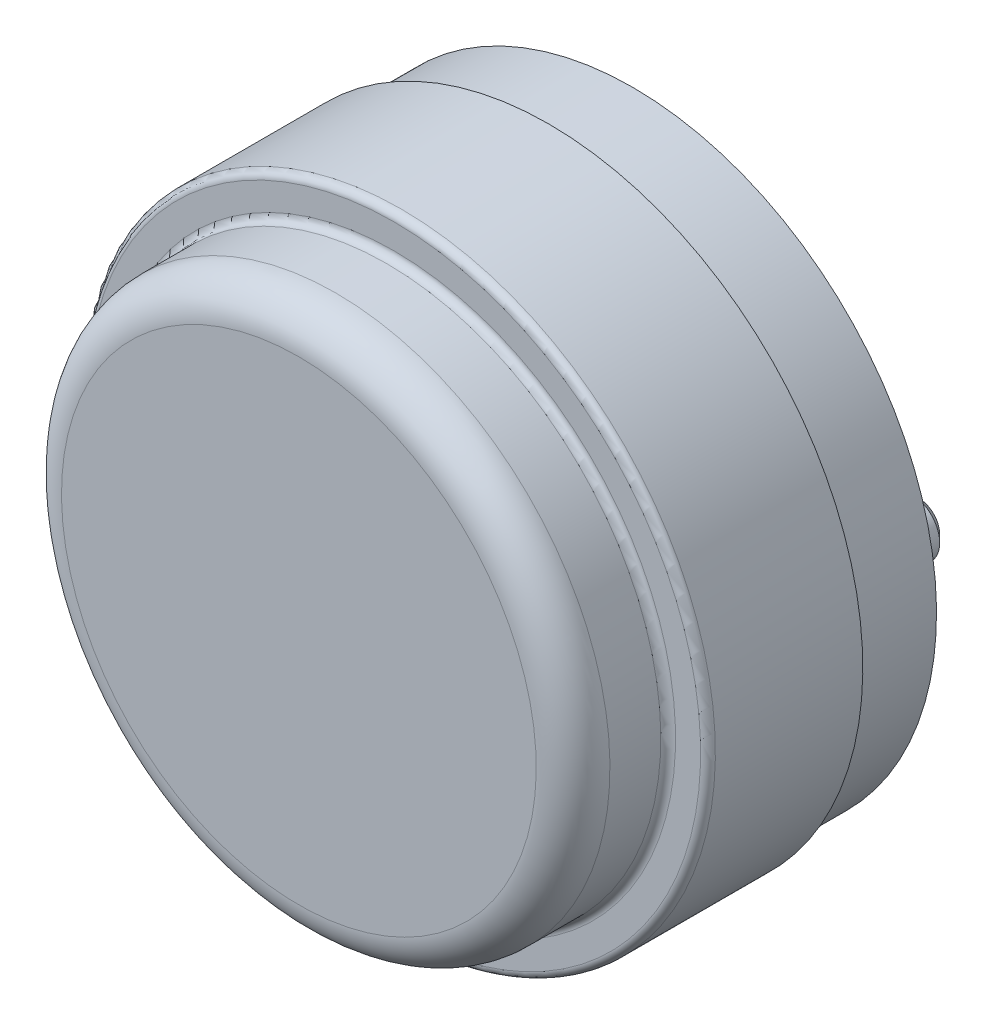
ISO-10303-21;
HEADER;
FILE_DESCRIPTION(('STEP AP214'),'2;1');
FILE_NAME('part.step','',(''),(''),'','','');
FILE_SCHEMA(('AUTOMOTIVE_DESIGN { 1 0 10303 214 1 1 1 1 }'));
ENDSEC;
DATA;
#1=APPLICATION_CONTEXT('core data for automotive mechanical design processes');
#2=APPLICATION_PROTOCOL_DEFINITION('international standard','automotive_design',2000,#1);
#3=PRODUCT_CONTEXT('',#1,'mechanical');
#4=PRODUCT('Part','Part','',(#3));
#5=PRODUCT_RELATED_PRODUCT_CATEGORY('part','',(#4));
#6=PRODUCT_DEFINITION_FORMATION('','',#4);
#7=PRODUCT_DEFINITION_CONTEXT('part definition',#1,'design');
#8=PRODUCT_DEFINITION('design','',#6,#7);
#9=PRODUCT_DEFINITION_SHAPE('','',#8);
#10=(LENGTH_UNIT() NAMED_UNIT(*) SI_UNIT(.MILLI.,.METRE.));
#11=(NAMED_UNIT(*) PLANE_ANGLE_UNIT() SI_UNIT($,.RADIAN.));
#12=(NAMED_UNIT(*) SI_UNIT($,.STERADIAN.) SOLID_ANGLE_UNIT());
#13=UNCERTAINTY_MEASURE_WITH_UNIT(LENGTH_MEASURE(1.E-05),#10,'distance_accuracy_value','');
#14=(GEOMETRIC_REPRESENTATION_CONTEXT(3) GLOBAL_UNCERTAINTY_ASSIGNED_CONTEXT((#13)) GLOBAL_UNIT_ASSIGNED_CONTEXT((#10,
#11,#12)) REPRESENTATION_CONTEXT('',''));
#15=CARTESIAN_POINT('',(0.,0.,0.));
#16=DIRECTION('',(0.,0.,1.));
#17=DIRECTION('',(1.,0.,0.));
#18=AXIS2_PLACEMENT_3D('',#15,#16,#17);
#19=CARTESIAN_POINT('',(0.,0.,7.62000000002265));
#20=DIRECTION('',(0.,0.,-1.));
#21=DIRECTION('',(0.,1.,0.));
#22=AXIS2_PLACEMENT_3D('',#19,#20,#21);
#23=PLANE('',#22);
#24=CARTESIAN_POINT('',(0.,0.,7.62000000002265));
#25=DIRECTION('',(0.,0.,-1.));
#26=DIRECTION('',(0.,1.,0.));
#27=AXIS2_PLACEMENT_3D('',#24,#25,#26);
#28=CIRCLE('',#27,5.08);
#29=CARTESIAN_POINT('',(0.,5.08,7.62000000002265));
#30=VERTEX_POINT('',#29);
#31=EDGE_CURVE('E56',#30,#30,#28,.T.);
#32=ORIENTED_EDGE('',*,*,#31,.T.);
#33=EDGE_LOOP('',(#32));
#34=FACE_BOUND('',#33,.T.);
#35=ADVANCED_FACE('F30',(#34),#23,.T.);
#36=CARTESIAN_POINT('',(0.,0.,0.));
#37=DIRECTION('',(0.,0.,-1.));
#38=DIRECTION('',(0.,1.,0.));
#39=AXIS2_PLACEMENT_3D('',#36,#37,#38);
#40=CYLINDRICAL_SURFACE('',#39,5.08);
#41=CARTESIAN_POINT('',(0.,0.,2.26539991139451E-11));
#42=DIRECTION('',(0.,0.,-1.));
#43=DIRECTION('',(0.,1.,0.));
#44=AXIS2_PLACEMENT_3D('',#41,#42,#43);
#45=CIRCLE('',#44,5.08);
#46=CARTESIAN_POINT('',(0.,5.08,2.26546212345191E-11));
#47=VERTEX_POINT('',#46);
#48=EDGE_CURVE('E59',#47,#47,#45,.T.);
#49=ORIENTED_EDGE('',*,*,#48,.T.);
#50=EDGE_LOOP('',(#49));
#51=FACE_BOUND('',#50,.T.);
#52=ORIENTED_EDGE('',*,*,#31,.F.);
#53=EDGE_LOOP('',(#52));
#54=FACE_BOUND('',#53,.T.);
#55=ADVANCED_FACE('F106',(#51,#54),#40,.F.);
#56=CARTESIAN_POINT('',(0.,5.08,2.26542915110506E-11));
#57=DIRECTION('',(0.,0.,-1.));
#58=DIRECTION('',(0.,1.,0.));
#59=AXIS2_PLACEMENT_3D('',#56,#57,#58);
#60=PLANE('',#59);
#61=CARTESIAN_POINT('',(-7.44220000000031,0.,2.26537538727811E-11));
#62=DIRECTION('',(0.,0.,-1.));
#63=DIRECTION('',(0.,1.,0.));
#64=AXIS2_PLACEMENT_3D('',#61,#62,#63);
#65=CIRCLE('',#64,0.97155);
#66=CARTESIAN_POINT('',(-7.44220000000031,0.97155,2.26538728533409E-11));
#67=VERTEX_POINT('',#66);
#68=EDGE_CURVE('E50',#67,#67,#65,.T.);
#69=ORIENTED_EDGE('',*,*,#68,.F.);
#70=EDGE_LOOP('',(#69));
#71=FACE_BOUND('',#70,.T.);
#72=CARTESIAN_POINT('',(7.44220000000031,0.,2.26537538727811E-11));
#73=DIRECTION('',(0.,0.,-1.));
#74=DIRECTION('',(0.,1.,0.));
#75=AXIS2_PLACEMENT_3D('',#72,#73,#74);
#76=CIRCLE('',#75,0.97155);
#77=CARTESIAN_POINT('',(7.44220000000031,0.97155,2.26538728533409E-11));
#78=VERTEX_POINT('',#77);
#79=EDGE_CURVE('E53',#78,#78,#76,.T.);
#80=ORIENTED_EDGE('',*,*,#79,.F.);
#81=EDGE_LOOP('',(#80));
#82=FACE_BOUND('',#81,.T.);
#83=CARTESIAN_POINT('',(0.,0.,2.26533396670082E-11));
#84=DIRECTION('',(0.,0.,-1.));
#85=DIRECTION('',(0.,1.,0.));
#86=AXIS2_PLACEMENT_3D('',#83,#84,#85);
#87=CIRCLE('',#86,10.4647928841899);
#88=CARTESIAN_POINT('',(0.,10.4647928841899,2.26546212345191E-11));
#89=VERTEX_POINT('',#88);
#90=EDGE_CURVE('E62',#89,#89,#87,.T.);
#91=ORIENTED_EDGE('',*,*,#90,.T.);
#92=EDGE_LOOP('',(#91));
#93=FACE_BOUND('',#92,.T.);
#94=ORIENTED_EDGE('',*,*,#48,.F.);
#95=EDGE_LOOP('',(#94));
#96=FACE_BOUND('',#95,.T.);
#97=ADVANCED_FACE('F112',(#71,#82,#93,#96),#60,.T.);
#98=CARTESIAN_POINT('',(0.,0.,0.));
#99=DIRECTION('',(0.,0.,-1.));
#100=DIRECTION('',(0.,1.,0.));
#101=AXIS2_PLACEMENT_3D('',#98,#99,#100);
#102=CYLINDRICAL_SURFACE('',#101,10.4647928841899);
#103=CARTESIAN_POINT('',(0.,0.,2.89559824733554));
#104=DIRECTION('',(0.,0.,-1.));
#105=DIRECTION('',(0.,1.,0.));
#106=AXIS2_PLACEMENT_3D('',#103,#104,#105);
#107=CIRCLE('',#106,10.4647928841899);
#108=CARTESIAN_POINT('',(0.,10.4647928841899,2.89559824733555));
#109=VERTEX_POINT('',#108);
#110=EDGE_CURVE('E65',#109,#109,#107,.T.);
#111=ORIENTED_EDGE('',*,*,#110,.T.);
#112=EDGE_LOOP('',(#111));
#113=FACE_BOUND('',#112,.T.);
#114=ORIENTED_EDGE('',*,*,#90,.F.);
#115=EDGE_LOOP('',(#114));
#116=FACE_BOUND('',#115,.T.);
#117=ADVANCED_FACE('F139',(#113,#116),#102,.T.);
#118=CARTESIAN_POINT('',(0.,10.4647928841899,2.89559824733555));
#119=DIRECTION('',(0.,0.,-1.));
#120=DIRECTION('',(0.,1.,0.));
#121=AXIS2_PLACEMENT_3D('',#118,#119,#120);
#122=PLANE('',#121);
#123=CARTESIAN_POINT('',(0.,0.,2.89559824733554));
#124=DIRECTION('',(0.,0.,-1.));
#125=DIRECTION('',(0.,1.,0.));
#126=AXIS2_PLACEMENT_3D('',#123,#124,#125);
#127=CIRCLE('',#126,10.8203928841899);
#128=CARTESIAN_POINT('',(0.,10.8203928841899,2.89559824733555));
#129=VERTEX_POINT('',#128);
#130=EDGE_CURVE('E68',#129,#129,#127,.T.);
#131=ORIENTED_EDGE('',*,*,#130,.T.);
#132=EDGE_LOOP('',(#131));
#133=FACE_BOUND('',#132,.T.);
#134=ORIENTED_EDGE('',*,*,#110,.F.);
#135=EDGE_LOOP('',(#134));
#136=FACE_BOUND('',#135,.T.);
#137=ADVANCED_FACE('F149',(#133,#136),#122,.T.);
#138=CARTESIAN_POINT('',(0.,0.,0.));
#139=DIRECTION('',(0.,0.,-1.));
#140=DIRECTION('',(0.,1.,0.));
#141=AXIS2_PLACEMENT_3D('',#138,#139,#140);
#142=CYLINDRICAL_SURFACE('',#141,10.8203928841899);
#143=CARTESIAN_POINT('',(0.,0.,7.97559824733555));
#144=DIRECTION('',(0.,0.,-1.));
#145=DIRECTION('',(0.,1.,0.));
#146=AXIS2_PLACEMENT_3D('',#143,#144,#145);
#147=CIRCLE('',#146,10.8203928841899);
#148=CARTESIAN_POINT('',(0.,10.8203928841899,7.97559824733555));
#149=VERTEX_POINT('',#148);
#150=EDGE_CURVE('E71',#149,#149,#147,.T.);
#151=ORIENTED_EDGE('',*,*,#150,.T.);
#152=EDGE_LOOP('',(#151));
#153=FACE_BOUND('',#152,.T.);
#154=ORIENTED_EDGE('',*,*,#130,.F.);
#155=EDGE_LOOP('',(#154));
#156=FACE_BOUND('',#155,.T.);
#157=ADVANCED_FACE('F155',(#153,#156),#142,.T.);
#158=CARTESIAN_POINT('',(0.,0.,7.97559824733555));
#159=DIRECTION('',(0.,0.,-1.));
#160=DIRECTION('',(0.,1.,0.));
#161=AXIS2_PLACEMENT_3D('',#158,#159,#160);
#162=TOROIDAL_SURFACE('',#161,10.5663928841899,0.253999999999999);
#163=CARTESIAN_POINT('',(0.,0.,8.22959824733555));
#164=DIRECTION('',(0.,0.,-1.));
#165=DIRECTION('',(0.,1.,0.));
#166=AXIS2_PLACEMENT_3D('',#163,#164,#165);
#167=CIRCLE('',#166,10.5663928841899);
#168=CARTESIAN_POINT('',(0.,10.5663928841899,8.22959824733555));
#169=VERTEX_POINT('',#168);
#170=EDGE_CURVE('E74',#169,#169,#167,.T.);
#171=ORIENTED_EDGE('',*,*,#170,.T.);
#172=EDGE_LOOP('',(#171));
#173=FACE_BOUND('',#172,.T.);
#174=ORIENTED_EDGE('',*,*,#150,.F.);
#175=EDGE_LOOP('',(#174));
#176=FACE_BOUND('',#175,.T.);
#177=ADVANCED_FACE('F161',(#173,#176),#162,.T.);
#178=CARTESIAN_POINT('',(0.,10.5663928841899,8.22959824733555));
#179=DIRECTION('',(0.,0.,1.));
#180=DIRECTION('',(0.,-1.,0.));
#181=AXIS2_PLACEMENT_3D('',#178,#179,#180);
#182=PLANE('',#181);
#183=CARTESIAN_POINT('',(0.,0.,8.22959824733555));
#184=DIRECTION('',(0.,0.,-1.));
#185=DIRECTION('',(0.,1.,0.));
#186=AXIS2_PLACEMENT_3D('',#183,#184,#185);
#187=CIRCLE('',#186,9.70279288418994);
#188=CARTESIAN_POINT('',(0.,9.70279288418993,8.22959824733555));
#189=VERTEX_POINT('',#188);
#190=EDGE_CURVE('E77',#189,#189,#187,.T.);
#191=ORIENTED_EDGE('',*,*,#190,.T.);
#192=EDGE_LOOP('',(#191));
#193=FACE_BOUND('',#192,.T.);
#194=ORIENTED_EDGE('',*,*,#170,.F.);
#195=EDGE_LOOP('',(#194));
#196=FACE_BOUND('',#195,.T.);
#197=ADVANCED_FACE('F165',(#193,#196),#182,.T.);
#198=CARTESIAN_POINT('',(0.,0.,8.48359824733555));
#199=DIRECTION('',(0.,0.,-1.));
#200=DIRECTION('',(0.,1.,0.));
#201=AXIS2_PLACEMENT_3D('',#198,#199,#200);
#202=TOROIDAL_SURFACE('',#201,9.70279288418994,0.254000000000001);
#203=CARTESIAN_POINT('',(0.,0.,8.48359824733555));
#204=DIRECTION('',(0.,0.,-1.));
#205=DIRECTION('',(0.,1.,0.));
#206=AXIS2_PLACEMENT_3D('',#203,#204,#205);
#207=CIRCLE('',#206,9.44879288418994);
#208=CARTESIAN_POINT('',(0.,9.44879288418993,8.48359824733555));
#209=VERTEX_POINT('',#208);
#210=EDGE_CURVE('E80',#209,#209,#207,.T.);
#211=ORIENTED_EDGE('',*,*,#210,.T.);
#212=EDGE_LOOP('',(#211));
#213=FACE_BOUND('',#212,.T.);
#214=ORIENTED_EDGE('',*,*,#190,.F.);
#215=EDGE_LOOP('',(#214));
#216=FACE_BOUND('',#215,.T.);
#217=ADVANCED_FACE('F169',(#213,#216),#202,.F.);
#218=CARTESIAN_POINT('',(0.,0.,0.));
#219=DIRECTION('',(0.,0.,-1.));
#220=DIRECTION('',(0.,1.,0.));
#221=AXIS2_PLACEMENT_3D('',#218,#219,#220);
#222=CYLINDRICAL_SURFACE('',#221,9.44879288418994);
#223=CARTESIAN_POINT('',(0.,0.,10.2362000000037));
#224=DIRECTION('',(0.,0.,-1.));
#225=DIRECTION('',(0.,1.,0.));
#226=AXIS2_PLACEMENT_3D('',#223,#224,#225);
#227=CIRCLE('',#226,9.44879288418994);
#228=CARTESIAN_POINT('',(0.,9.44879288418993,10.2362000000037));
#229=VERTEX_POINT('',#228);
#230=EDGE_CURVE('E83',#229,#229,#227,.T.);
#231=ORIENTED_EDGE('',*,*,#230,.T.);
#232=EDGE_LOOP('',(#231));
#233=FACE_BOUND('',#232,.T.);
#234=ORIENTED_EDGE('',*,*,#210,.F.);
#235=EDGE_LOOP('',(#234));
#236=FACE_BOUND('',#235,.T.);
#237=ADVANCED_FACE('F103',(#233,#236),#222,.T.);
#238=CARTESIAN_POINT('',(0.,0.,10.2362000000037));
#239=DIRECTION('',(0.,0.,-1.));
#240=DIRECTION('',(0.,1.,0.));
#241=AXIS2_PLACEMENT_3D('',#238,#239,#240);
#242=TOROIDAL_SURFACE('',#241,8.17879288418993,1.27);
#243=CARTESIAN_POINT('',(0.,0.,11.5062000000037));
#244=DIRECTION('',(0.,0.,-1.));
#245=DIRECTION('',(0.,1.,0.));
#246=AXIS2_PLACEMENT_3D('',#243,#244,#245);
#247=CIRCLE('',#246,8.17879288418993);
#248=CARTESIAN_POINT('',(0.,8.17879288418993,11.5062000000037));
#249=VERTEX_POINT('',#248);
#250=EDGE_CURVE('E86',#249,#249,#247,.T.);
#251=ORIENTED_EDGE('',*,*,#250,.T.);
#252=EDGE_LOOP('',(#251));
#253=FACE_BOUND('',#252,.T.);
#254=ORIENTED_EDGE('',*,*,#230,.F.);
#255=EDGE_LOOP('',(#254));
#256=FACE_BOUND('',#255,.T.);
#257=ADVANCED_FACE('F90',(#253,#256),#242,.T.);
#258=CARTESIAN_POINT('',(0.,8.17879288418993,11.5062000000037));
#259=DIRECTION('',(0.,0.,1.));
#260=DIRECTION('',(0.,-1.,0.));
#261=AXIS2_PLACEMENT_3D('',#258,#259,#260);
#262=PLANE('',#261);
#263=ORIENTED_EDGE('',*,*,#250,.F.);
#264=EDGE_LOOP('',(#263));
#265=FACE_BOUND('',#264,.T.);
#266=ADVANCED_FACE('F93',(#265),#262,.T.);
#267=CARTESIAN_POINT('',(7.44220000000031,0.,-2.41));
#268=DIRECTION('',(0.,0.,1.));
#269=DIRECTION('',(1.,0.,0.));
#270=AXIS2_PLACEMENT_3D('',#267,#268,#269);
#271=CYLINDRICAL_SURFACE('',#270,0.97155);
#272=CARTESIAN_POINT('',(7.44220000000031,0.,-2.16000000000001));
#273=DIRECTION('',(0.,0.,1.));
#274=DIRECTION('',(1.,0.,0.));
#275=AXIS2_PLACEMENT_3D('',#272,#273,#274);
#276=CIRCLE('',#275,0.97155);
#277=CARTESIAN_POINT('',(8.41375000000031,0.,-2.16000000000001));
#278=VERTEX_POINT('',#277);
#279=EDGE_CURVE('E37',#278,#278,#276,.T.);
#280=ORIENTED_EDGE('',*,*,#279,.T.);
#281=EDGE_LOOP('',(#280));
#282=FACE_BOUND('',#281,.T.);
#283=ORIENTED_EDGE('',*,*,#79,.T.);
#284=EDGE_LOOP('',(#283));
#285=FACE_BOUND('',#284,.T.);
#286=ADVANCED_FACE('F95',(#282,#285),#271,.T.);
#287=CARTESIAN_POINT('',(7.44220000000031,0.,-2.41));
#288=DIRECTION('',(0.,0.,1.));
#289=DIRECTION('',(1.,0.,0.));
#290=AXIS2_PLACEMENT_3D('',#287,#288,#289);
#291=PLANE('',#290);
#292=CARTESIAN_POINT('',(7.44220000000031,0.,-2.41));
#293=DIRECTION('',(0.,0.,1.));
#294=DIRECTION('',(1.,0.,0.));
#295=AXIS2_PLACEMENT_3D('',#292,#293,#294);
#296=CIRCLE('',#295,0.721550000000005);
#297=CARTESIAN_POINT('',(8.16375000000031,0.,-2.41));
#298=VERTEX_POINT('',#297);
#299=EDGE_CURVE('E10',#298,#298,#296,.F.);
#300=ORIENTED_EDGE('',*,*,#299,.T.);
#301=EDGE_LOOP('',(#300));
#302=FACE_BOUND('',#301,.T.);
#303=ADVANCED_FACE('F101',(#302),#291,.F.);
#304=CARTESIAN_POINT('',(-7.44220000000031,0.,-2.41));
#305=DIRECTION('',(0.,0.,1.));
#306=DIRECTION('',(1.,0.,0.));
#307=AXIS2_PLACEMENT_3D('',#304,#305,#306);
#308=CYLINDRICAL_SURFACE('',#307,0.97155);
#309=CARTESIAN_POINT('',(-7.44220000000031,0.,-2.16000000000001));
#310=DIRECTION('',(0.,0.,-1.));
#311=DIRECTION('',(-1.,0.,0.));
#312=AXIS2_PLACEMENT_3D('',#309,#310,#311);
#313=CIRCLE('',#312,0.97155);
#314=CARTESIAN_POINT('',(-8.41375000000031,0.,-2.16000000000001));
#315=VERTEX_POINT('',#314);
#316=EDGE_CURVE('E45',#315,#315,#313,.F.);
#317=ORIENTED_EDGE('',*,*,#316,.T.);
#318=EDGE_LOOP('',(#317));
#319=FACE_BOUND('',#318,.T.);
#320=ORIENTED_EDGE('',*,*,#68,.T.);
#321=EDGE_LOOP('',(#320));
#322=FACE_BOUND('',#321,.T.);
#323=ADVANCED_FACE('F125',(#319,#322),#308,.T.);
#324=CARTESIAN_POINT('',(-7.44220000000031,0.,-2.41));
#325=DIRECTION('',(0.,0.,-1.));
#326=DIRECTION('',(-1.,0.,0.));
#327=AXIS2_PLACEMENT_3D('',#324,#325,#326);
#328=PLANE('',#327);
#329=CARTESIAN_POINT('',(-7.44220000000031,0.,-2.41));
#330=DIRECTION('',(0.,0.,-1.));
#331=DIRECTION('',(-1.,0.,0.));
#332=AXIS2_PLACEMENT_3D('',#329,#330,#331);
#333=CIRCLE('',#332,0.721550000000005);
#334=CARTESIAN_POINT('',(-8.16375000000031,0.,-2.41));
#335=VERTEX_POINT('',#334);
#336=EDGE_CURVE('E41',#335,#335,#333,.T.);
#337=ORIENTED_EDGE('',*,*,#336,.T.);
#338=EDGE_LOOP('',(#337));
#339=FACE_BOUND('',#338,.T.);
#340=ADVANCED_FACE('F118',(#339),#328,.T.);
#341=CARTESIAN_POINT('',(-7.44220000000031,0.,-2.16000000000001));
#342=DIRECTION('',(0.,0.,1.));
#343=DIRECTION('',(1.,0.,0.));
#344=AXIS2_PLACEMENT_3D('',#341,#342,#343);
#345=CONICAL_SURFACE('',#344,0.97155,0.785398163397455);
#346=ORIENTED_EDGE('',*,*,#336,.F.);
#347=EDGE_LOOP('',(#346));
#348=FACE_BOUND('',#347,.T.);
#349=ORIENTED_EDGE('',*,*,#316,.F.);
#350=EDGE_LOOP('',(#349));
#351=FACE_BOUND('',#350,.T.);
#352=ADVANCED_FACE('F116',(#348,#351),#345,.T.);
#353=CARTESIAN_POINT('',(7.44220000000031,0.,-2.16000000000001));
#354=DIRECTION('',(0.,0.,1.));
#355=DIRECTION('',(1.,0.,0.));
#356=AXIS2_PLACEMENT_3D('',#353,#354,#355);
#357=CONICAL_SURFACE('',#356,0.97155,0.785398163397455);
#358=ORIENTED_EDGE('',*,*,#299,.F.);
#359=EDGE_LOOP('',(#358));
#360=FACE_BOUND('',#359,.T.);
#361=ORIENTED_EDGE('',*,*,#279,.F.);
#362=EDGE_LOOP('',(#361));
#363=FACE_BOUND('',#362,.T.);
#364=ADVANCED_FACE('F32',(#360,#363),#357,.T.);
#365=CLOSED_SHELL('',(#35,#55,#97,#117,#137,#157,#177,#197,#217,#237,#257,#266,#286,#303,#323,
#340,#352,#364));
#366=MANIFOLD_SOLID_BREP('B2',#365);
#367=ADVANCED_BREP_SHAPE_REPRESENTATION('',(#18,#366),#14);
#368=SHAPE_DEFINITION_REPRESENTATION(#9,#367);
ENDSEC;
END-ISO-10303-21;
